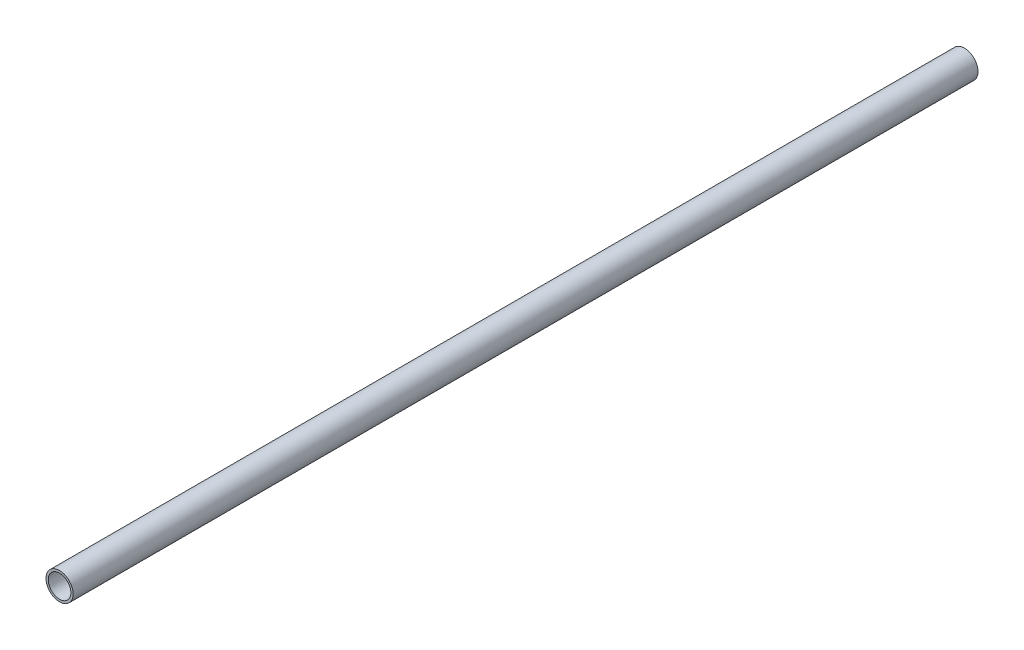
ISO-10303-21;
HEADER;
FILE_DESCRIPTION(('STEP AP214'),'2;1');
FILE_NAME('part.step','',(''),(''),'','','');
FILE_SCHEMA(('AUTOMOTIVE_DESIGN { 1 0 10303 214 1 1 1 1 }'));
ENDSEC;
DATA;
#1=APPLICATION_CONTEXT('core data for automotive mechanical design processes');
#2=APPLICATION_PROTOCOL_DEFINITION('international standard','automotive_design',2000,#1);
#3=PRODUCT_CONTEXT('',#1,'mechanical');
#4=PRODUCT('Part','Part','',(#3));
#5=PRODUCT_RELATED_PRODUCT_CATEGORY('part','',(#4));
#6=PRODUCT_DEFINITION_FORMATION('','',#4);
#7=PRODUCT_DEFINITION_CONTEXT('part definition',#1,'design');
#8=PRODUCT_DEFINITION('design','',#6,#7);
#9=PRODUCT_DEFINITION_SHAPE('','',#8);
#10=(LENGTH_UNIT() NAMED_UNIT(*) SI_UNIT(.MILLI.,.METRE.));
#11=(NAMED_UNIT(*) PLANE_ANGLE_UNIT() SI_UNIT($,.RADIAN.));
#12=(NAMED_UNIT(*) SI_UNIT($,.STERADIAN.) SOLID_ANGLE_UNIT());
#13=UNCERTAINTY_MEASURE_WITH_UNIT(LENGTH_MEASURE(1.E-05),#10,'distance_accuracy_value','');
#14=(GEOMETRIC_REPRESENTATION_CONTEXT(3) GLOBAL_UNCERTAINTY_ASSIGNED_CONTEXT((#13)) GLOBAL_UNIT_ASSIGNED_CONTEXT((#10,
#11,#12)) REPRESENTATION_CONTEXT('',''));
#15=CARTESIAN_POINT('',(0.,0.,0.));
#16=DIRECTION('',(0.,0.,1.));
#17=DIRECTION('',(1.,0.,0.));
#18=AXIS2_PLACEMENT_3D('',#15,#16,#17);
#19=CARTESIAN_POINT('',(0.,0.,200.));
#20=DIRECTION('',(0.,0.,1.));
#21=DIRECTION('',(1.,0.,0.));
#22=AXIS2_PLACEMENT_3D('',#19,#20,#21);
#23=PLANE('',#22);
#24=CARTESIAN_POINT('',(0.,0.,200.));
#25=DIRECTION('',(0.,0.,1.));
#26=DIRECTION('',(1.,0.,0.));
#27=AXIS2_PLACEMENT_3D('',#24,#25,#26);
#28=CIRCLE('',#27,3.);
#29=CARTESIAN_POINT('',(3.,0.,200.));
#30=VERTEX_POINT('',#29);
#31=EDGE_CURVE('E10',#30,#30,#28,.T.);
#32=ORIENTED_EDGE('',*,*,#31,.T.);
#33=EDGE_LOOP('',(#32));
#34=FACE_BOUND('',#33,.T.);
#35=CARTESIAN_POINT('',(0.,0.,200.));
#36=DIRECTION('',(0.,0.,1.));
#37=DIRECTION('',(1.,0.,0.));
#38=AXIS2_PLACEMENT_3D('',#35,#36,#37);
#39=CIRCLE('',#38,2.5);
#40=CARTESIAN_POINT('',(2.5,0.,200.));
#41=VERTEX_POINT('',#40);
#42=EDGE_CURVE('E44',#41,#41,#39,.T.);
#43=ORIENTED_EDGE('',*,*,#42,.F.);
#44=EDGE_LOOP('',(#43));
#45=FACE_BOUND('',#44,.T.);
#46=ADVANCED_FACE('F33',(#34,#45),#23,.T.);
#47=CARTESIAN_POINT('',(0.,0.,0.));
#48=DIRECTION('',(0.,0.,1.));
#49=DIRECTION('',(1.,0.,0.));
#50=AXIS2_PLACEMENT_3D('',#47,#48,#49);
#51=PLANE('',#50);
#52=CARTESIAN_POINT('',(0.,0.,0.));
#53=DIRECTION('',(0.,0.,1.));
#54=DIRECTION('',(1.,0.,0.));
#55=AXIS2_PLACEMENT_3D('',#52,#53,#54);
#56=CIRCLE('',#55,3.);
#57=CARTESIAN_POINT('',(3.,0.,0.));
#58=VERTEX_POINT('',#57);
#59=EDGE_CURVE('E37',#58,#58,#56,.T.);
#60=ORIENTED_EDGE('',*,*,#59,.F.);
#61=EDGE_LOOP('',(#60));
#62=FACE_BOUND('',#61,.T.);
#63=CARTESIAN_POINT('',(0.,0.,0.));
#64=DIRECTION('',(0.,0.,1.));
#65=DIRECTION('',(1.,0.,0.));
#66=AXIS2_PLACEMENT_3D('',#63,#64,#65);
#67=CIRCLE('',#66,2.5);
#68=CARTESIAN_POINT('',(2.5,0.,0.));
#69=VERTEX_POINT('',#68);
#70=EDGE_CURVE('E46',#69,#69,#67,.T.);
#71=ORIENTED_EDGE('',*,*,#70,.T.);
#72=EDGE_LOOP('',(#71));
#73=FACE_BOUND('',#72,.T.);
#74=ADVANCED_FACE('F56',(#62,#73),#51,.F.);
#75=CARTESIAN_POINT('',(0.,0.,200.));
#76=DIRECTION('',(0.,0.,-1.));
#77=DIRECTION('',(-1.,0.,0.));
#78=AXIS2_PLACEMENT_3D('',#75,#76,#77);
#79=CYLINDRICAL_SURFACE('',#78,3.);
#80=ORIENTED_EDGE('',*,*,#31,.F.);
#81=EDGE_LOOP('',(#80));
#82=FACE_BOUND('',#81,.T.);
#83=ORIENTED_EDGE('',*,*,#59,.T.);
#84=EDGE_LOOP('',(#83));
#85=FACE_BOUND('',#84,.T.);
#86=ADVANCED_FACE('F35',(#82,#85),#79,.T.);
#87=CARTESIAN_POINT('',(0.,0.,200.));
#88=DIRECTION('',(0.,0.,-1.));
#89=DIRECTION('',(-1.,0.,0.));
#90=AXIS2_PLACEMENT_3D('',#87,#88,#89);
#91=CYLINDRICAL_SURFACE('',#90,2.5);
#92=ORIENTED_EDGE('',*,*,#42,.T.);
#93=EDGE_LOOP('',(#92));
#94=FACE_BOUND('',#93,.T.);
#95=ORIENTED_EDGE('',*,*,#70,.F.);
#96=EDGE_LOOP('',(#95));
#97=FACE_BOUND('',#96,.T.);
#98=ADVANCED_FACE('F52',(#94,#97),#91,.F.);
#99=CLOSED_SHELL('',(#46,#74,#86,#98));
#100=MANIFOLD_SOLID_BREP('B2',#99);
#101=ADVANCED_BREP_SHAPE_REPRESENTATION('',(#18,#100),#14);
#102=SHAPE_DEFINITION_REPRESENTATION(#9,#101);
ENDSEC;
END-ISO-10303-21;
